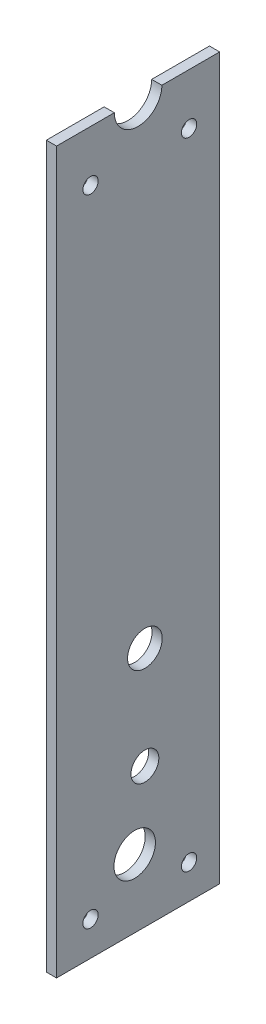
ISO-10303-21;
HEADER;
FILE_DESCRIPTION(('STEP AP214'),'2;1');
FILE_NAME('part.step','',(''),(''),'','','');
FILE_SCHEMA(('AUTOMOTIVE_DESIGN { 1 0 10303 214 1 1 1 1 }'));
ENDSEC;
DATA;
#1=APPLICATION_CONTEXT('core data for automotive mechanical design processes');
#2=APPLICATION_PROTOCOL_DEFINITION('international standard','automotive_design',2000,#1);
#3=PRODUCT_CONTEXT('',#1,'mechanical');
#4=PRODUCT('Part','Part','',(#3));
#5=PRODUCT_RELATED_PRODUCT_CATEGORY('part','',(#4));
#6=PRODUCT_DEFINITION_FORMATION('','',#4);
#7=PRODUCT_DEFINITION_CONTEXT('part definition',#1,'design');
#8=PRODUCT_DEFINITION('design','',#6,#7);
#9=PRODUCT_DEFINITION_SHAPE('','',#8);
#10=(LENGTH_UNIT() NAMED_UNIT(*) SI_UNIT(.MILLI.,.METRE.));
#11=(NAMED_UNIT(*) PLANE_ANGLE_UNIT() SI_UNIT($,.RADIAN.));
#12=(NAMED_UNIT(*) SI_UNIT($,.STERADIAN.) SOLID_ANGLE_UNIT());
#13=UNCERTAINTY_MEASURE_WITH_UNIT(LENGTH_MEASURE(1.E-05),#10,'distance_accuracy_value','');
#14=(GEOMETRIC_REPRESENTATION_CONTEXT(3) GLOBAL_UNCERTAINTY_ASSIGNED_CONTEXT((#13)) GLOBAL_UNIT_ASSIGNED_CONTEXT((#10,
#11,#12)) REPRESENTATION_CONTEXT('',''));
#15=CARTESIAN_POINT('',(0.,0.,0.));
#16=DIRECTION('',(0.,0.,1.));
#17=DIRECTION('',(1.,0.,0.));
#18=AXIS2_PLACEMENT_3D('',#15,#16,#17);
#19=CARTESIAN_POINT('',(0.,42.,30.));
#20=DIRECTION('',(0.,1.,0.));
#21=DIRECTION('',(0.,0.,1.));
#22=AXIS2_PLACEMENT_3D('',#19,#20,#21);
#23=PLANE('',#22);
#24=DIRECTION('',(1.,0.,0.));
#25=VECTOR('',#24,1.);
#26=CARTESIAN_POINT('',(-1.8,42.,61.));
#27=LINE('',#26,#25);
#28=CARTESIAN_POINT('',(-1.5,42.,61.));
#29=VERTEX_POINT('',#28);
#30=CARTESIAN_POINT('',(1.5,42.,61.));
#31=VERTEX_POINT('',#30);
#32=EDGE_CURVE('E30',#29,#31,#27,.T.);
#33=ORIENTED_EDGE('',*,*,#32,.F.);
#34=DIRECTION('',(0.,0.,1.));
#35=VECTOR('',#34,1.);
#36=CARTESIAN_POINT('',(-1.5,42.,30.));
#37=LINE('',#36,#35);
#38=CARTESIAN_POINT('',(-1.5,42.,78.));
#39=VERTEX_POINT('',#38);
#40=EDGE_CURVE('E84',#29,#39,#37,.T.);
#41=ORIENTED_EDGE('',*,*,#40,.T.);
#42=DIRECTION('',(1.,0.,0.));
#43=VECTOR('',#42,1.);
#44=CARTESIAN_POINT('',(0.,42.,78.));
#45=LINE('',#44,#43);
#46=CARTESIAN_POINT('',(1.5,42.,78.));
#47=VERTEX_POINT('',#46);
#48=EDGE_CURVE('E98',#39,#47,#45,.T.);
#49=ORIENTED_EDGE('',*,*,#48,.T.);
#50=DIRECTION('',(0.,0.,1.));
#51=VECTOR('',#50,1.);
#52=CARTESIAN_POINT('',(1.5,42.,30.));
#53=LINE('',#52,#51);
#54=EDGE_CURVE('E85',#31,#47,#53,.T.);
#55=ORIENTED_EDGE('',*,*,#54,.F.);
#56=EDGE_LOOP('',(#33,#41,#49,#55));
#57=FACE_BOUND('',#56,.T.);
#58=ADVANCED_FACE('F16',(#57),#23,.T.);
#59=CARTESIAN_POINT('',(0.,-64.,78.));
#60=DIRECTION('',(0.,0.,1.));
#61=DIRECTION('',(1.,0.,0.));
#62=AXIS2_PLACEMENT_3D('',#59,#60,#61);
#63=PLANE('',#62);
#64=DIRECTION('',(-1.,0.,0.));
#65=VECTOR('',#64,1.);
#66=CARTESIAN_POINT('',(0.,-170.,78.));
#67=LINE('',#66,#65);
#68=CARTESIAN_POINT('',(1.5,-170.,78.));
#69=VERTEX_POINT('',#68);
#70=CARTESIAN_POINT('',(-1.5,-170.,78.));
#71=VERTEX_POINT('',#70);
#72=EDGE_CURVE('E24',#69,#71,#67,.T.);
#73=ORIENTED_EDGE('',*,*,#72,.F.);
#74=DIRECTION('',(0.,-1.,0.));
#75=VECTOR('',#74,1.);
#76=CARTESIAN_POINT('',(1.5,-64.,78.));
#77=LINE('',#76,#75);
#78=EDGE_CURVE('E95',#47,#69,#77,.T.);
#79=ORIENTED_EDGE('',*,*,#78,.F.);
#80=ORIENTED_EDGE('',*,*,#48,.F.);
#81=DIRECTION('',(0.,1.,0.));
#82=VECTOR('',#81,1.);
#83=CARTESIAN_POINT('',(-1.5,-64.,78.));
#84=LINE('',#83,#82);
#85=EDGE_CURVE('E101',#71,#39,#84,.T.);
#86=ORIENTED_EDGE('',*,*,#85,.F.);
#87=EDGE_LOOP('',(#73,#79,#80,#86));
#88=FACE_BOUND('',#87,.T.);
#89=ADVANCED_FACE('F18',(#88),#63,.T.);
#90=CARTESIAN_POINT('',(0.,-170.,30.));
#91=DIRECTION('',(0.,-1.,0.));
#92=DIRECTION('',(0.,0.,-1.));
#93=AXIS2_PLACEMENT_3D('',#90,#91,#92);
#94=PLANE('',#93);
#95=DIRECTION('',(0.,0.,1.));
#96=VECTOR('',#95,1.);
#97=CARTESIAN_POINT('',(1.5,-170.,30.));
#98=LINE('',#97,#96);
#99=CARTESIAN_POINT('',(1.5,-170.,30.));
#100=VERTEX_POINT('',#99);
#101=EDGE_CURVE('E88',#100,#69,#98,.T.);
#102=ORIENTED_EDGE('',*,*,#101,.T.);
#103=ORIENTED_EDGE('',*,*,#72,.T.);
#104=DIRECTION('',(0.,0.,1.));
#105=VECTOR('',#104,1.);
#106=CARTESIAN_POINT('',(-1.5,-170.,30.));
#107=LINE('',#106,#105);
#108=CARTESIAN_POINT('',(-1.5,-170.,30.));
#109=VERTEX_POINT('',#108);
#110=EDGE_CURVE('E92',#109,#71,#107,.T.);
#111=ORIENTED_EDGE('',*,*,#110,.F.);
#112=DIRECTION('',(1.,0.,0.));
#113=VECTOR('',#112,1.);
#114=CARTESIAN_POINT('',(0.,-170.,30.));
#115=LINE('',#114,#113);
#116=EDGE_CURVE('E151',#109,#100,#115,.T.);
#117=ORIENTED_EDGE('',*,*,#116,.T.);
#118=EDGE_LOOP('',(#102,#103,#111,#117));
#119=FACE_BOUND('',#118,.T.);
#120=ADVANCED_FACE('F165',(#119),#94,.T.);
#121=CARTESIAN_POINT('',(-1.5,-64.,30.));
#122=DIRECTION('',(-1.,0.,0.));
#123=DIRECTION('',(0.,0.,1.));
#124=AXIS2_PLACEMENT_3D('',#121,#122,#123);
#125=PLANE('',#124);
#126=CARTESIAN_POINT('',(-1.5,42.,54.));
#127=DIRECTION('',(-1.,0.,0.));
#128=DIRECTION('',(0.,0.,1.));
#129=AXIS2_PLACEMENT_3D('',#126,#127,#128);
#130=CIRCLE('',#129,7.);
#131=CARTESIAN_POINT('',(-1.5,42.,47.));
#132=VERTEX_POINT('',#131);
#133=EDGE_CURVE('E131',#132,#29,#130,.T.);
#134=ORIENTED_EDGE('',*,*,#133,.F.);
#135=CARTESIAN_POINT('',(-1.5,42.,30.));
#136=VERTEX_POINT('',#135);
#137=EDGE_CURVE('E77',#136,#132,#37,.T.);
#138=ORIENTED_EDGE('',*,*,#137,.F.);
#139=DIRECTION('',(0.,-1.,0.));
#140=VECTOR('',#139,1.);
#141=CARTESIAN_POINT('',(-1.5,-64.,30.));
#142=LINE('',#141,#140);
#143=EDGE_CURVE('E154',#136,#109,#142,.T.);
#144=ORIENTED_EDGE('',*,*,#143,.T.);
#145=ORIENTED_EDGE('',*,*,#110,.T.);
#146=ORIENTED_EDGE('',*,*,#85,.T.);
#147=ORIENTED_EDGE('',*,*,#40,.F.);
#148=EDGE_LOOP('',(#134,#138,#144,#145,#146,#147));
#149=FACE_BOUND('',#148,.T.);
#150=CARTESIAN_POINT('',(-1.5,27.,68.));
#151=DIRECTION('',(-1.,0.,0.));
#152=DIRECTION('',(0.,0.,1.));
#153=AXIS2_PLACEMENT_3D('',#150,#151,#152);
#154=CIRCLE('',#153,2.25);
#155=CARTESIAN_POINT('',(-1.5,27.,70.25));
#156=VERTEX_POINT('',#155);
#157=EDGE_CURVE('E128',#156,#156,#154,.T.);
#158=ORIENTED_EDGE('',*,*,#157,.F.);
#159=EDGE_LOOP('',(#158));
#160=FACE_BOUND('',#159,.T.);
#161=CARTESIAN_POINT('',(-1.5,27.,39.));
#162=DIRECTION('',(-1.,0.,0.));
#163=DIRECTION('',(0.,0.,1.));
#164=AXIS2_PLACEMENT_3D('',#161,#162,#163);
#165=CIRCLE('',#164,2.25);
#166=CARTESIAN_POINT('',(-1.5,27.,41.25));
#167=VERTEX_POINT('',#166);
#168=EDGE_CURVE('E125',#167,#167,#165,.T.);
#169=ORIENTED_EDGE('',*,*,#168,.F.);
#170=EDGE_LOOP('',(#169));
#171=FACE_BOUND('',#170,.T.);
#172=CARTESIAN_POINT('',(-1.5,-160.,68.));
#173=DIRECTION('',(-1.,0.,0.));
#174=DIRECTION('',(0.,0.,1.));
#175=AXIS2_PLACEMENT_3D('',#172,#173,#174);
#176=CIRCLE('',#175,2.25);
#177=CARTESIAN_POINT('',(-1.5,-160.,70.25));
#178=VERTEX_POINT('',#177);
#179=EDGE_CURVE('E121',#178,#178,#176,.T.);
#180=ORIENTED_EDGE('',*,*,#179,.F.);
#181=EDGE_LOOP('',(#180));
#182=FACE_BOUND('',#181,.T.);
#183=CARTESIAN_POINT('',(-1.5,-160.,39.));
#184=DIRECTION('',(-1.,0.,0.));
#185=DIRECTION('',(0.,0.,1.));
#186=AXIS2_PLACEMENT_3D('',#183,#184,#185);
#187=CIRCLE('',#186,2.25);
#188=CARTESIAN_POINT('',(-1.5,-160.,41.25));
#189=VERTEX_POINT('',#188);
#190=EDGE_CURVE('E117',#189,#189,#187,.T.);
#191=ORIENTED_EDGE('',*,*,#190,.F.);
#192=EDGE_LOOP('',(#191));
#193=FACE_BOUND('',#192,.T.);
#194=CARTESIAN_POINT('',(-1.5,-99.,52.));
#195=DIRECTION('',(-1.,0.,0.));
#196=DIRECTION('',(0.,0.,1.));
#197=AXIS2_PLACEMENT_3D('',#194,#195,#196);
#198=CIRCLE('',#197,5.1);
#199=CARTESIAN_POINT('',(-1.5,-99.,57.1));
#200=VERTEX_POINT('',#199);
#201=EDGE_CURVE('E113',#200,#200,#198,.T.);
#202=ORIENTED_EDGE('',*,*,#201,.F.);
#203=EDGE_LOOP('',(#202));
#204=FACE_BOUND('',#203,.T.);
#205=CARTESIAN_POINT('',(-1.5,-150.,55.));
#206=DIRECTION('',(-1.,0.,0.));
#207=DIRECTION('',(0.,0.,1.));
#208=AXIS2_PLACEMENT_3D('',#205,#206,#207);
#209=CIRCLE('',#208,6.1);
#210=CARTESIAN_POINT('',(-1.5,-150.,61.1));
#211=VERTEX_POINT('',#210);
#212=EDGE_CURVE('E109',#211,#211,#209,.T.);
#213=ORIENTED_EDGE('',*,*,#212,.F.);
#214=EDGE_LOOP('',(#213));
#215=FACE_BOUND('',#214,.T.);
#216=CARTESIAN_POINT('',(-1.5,-129.,52.));
#217=DIRECTION('',(-1.,0.,0.));
#218=DIRECTION('',(0.,0.,1.));
#219=AXIS2_PLACEMENT_3D('',#216,#217,#218);
#220=CIRCLE('',#219,4.1);
#221=CARTESIAN_POINT('',(-1.5,-129.,56.1));
#222=VERTEX_POINT('',#221);
#223=EDGE_CURVE('E108',#222,#222,#220,.T.);
#224=ORIENTED_EDGE('',*,*,#223,.F.);
#225=EDGE_LOOP('',(#224));
#226=FACE_BOUND('',#225,.T.);
#227=ADVANCED_FACE('F161',(#149,#160,#171,#182,#193,#204,#215,#226),#125,.T.);
#228=DIRECTION('',(1.,0.,0.));
#229=VECTOR('',#228,1.);
#230=CARTESIAN_POINT('',(-1.8,42.,47.));
#231=LINE('',#230,#229);
#232=CARTESIAN_POINT('',(1.5,42.,47.));
#233=VERTEX_POINT('',#232);
#234=EDGE_CURVE('E66',#233,#132,#231,.F.);
#235=ORIENTED_EDGE('',*,*,#234,.F.);
#236=CARTESIAN_POINT('',(1.5,42.,30.));
#237=VERTEX_POINT('',#236);
#238=EDGE_CURVE('E75',#237,#233,#53,.T.);
#239=ORIENTED_EDGE('',*,*,#238,.F.);
#240=DIRECTION('',(-1.,0.,0.));
#241=VECTOR('',#240,1.);
#242=CARTESIAN_POINT('',(0.,42.,30.));
#243=LINE('',#242,#241);
#244=EDGE_CURVE('E156',#237,#136,#243,.T.);
#245=ORIENTED_EDGE('',*,*,#244,.T.);
#246=ORIENTED_EDGE('',*,*,#137,.T.);
#247=EDGE_LOOP('',(#235,#239,#245,#246));
#248=FACE_BOUND('',#247,.T.);
#249=ADVANCED_FACE('F73',(#248),#23,.T.);
#250=CARTESIAN_POINT('',(0.,-64.,30.));
#251=DIRECTION('',(0.,0.,-1.));
#252=DIRECTION('',(-1.,0.,0.));
#253=AXIS2_PLACEMENT_3D('',#250,#251,#252);
#254=PLANE('',#253);
#255=DIRECTION('',(0.,1.,0.));
#256=VECTOR('',#255,1.);
#257=CARTESIAN_POINT('',(1.5,-64.,30.));
#258=LINE('',#257,#256);
#259=EDGE_CURVE('E83',#100,#237,#258,.T.);
#260=ORIENTED_EDGE('',*,*,#259,.F.);
#261=ORIENTED_EDGE('',*,*,#116,.F.);
#262=ORIENTED_EDGE('',*,*,#143,.F.);
#263=ORIENTED_EDGE('',*,*,#244,.F.);
#264=EDGE_LOOP('',(#260,#261,#262,#263));
#265=FACE_BOUND('',#264,.T.);
#266=ADVANCED_FACE('F164',(#265),#254,.T.);
#267=CARTESIAN_POINT('',(1.5,-64.,30.));
#268=DIRECTION('',(1.,0.,0.));
#269=DIRECTION('',(0.,0.,-1.));
#270=AXIS2_PLACEMENT_3D('',#267,#268,#269);
#271=PLANE('',#270);
#272=CARTESIAN_POINT('',(1.5,42.,54.));
#273=DIRECTION('',(1.,0.,0.));
#274=DIRECTION('',(0.,0.,-1.));
#275=AXIS2_PLACEMENT_3D('',#272,#273,#274);
#276=CIRCLE('',#275,7.);
#277=EDGE_CURVE('E10',#31,#233,#276,.T.);
#278=ORIENTED_EDGE('',*,*,#277,.F.);
#279=ORIENTED_EDGE('',*,*,#54,.T.);
#280=ORIENTED_EDGE('',*,*,#78,.T.);
#281=ORIENTED_EDGE('',*,*,#101,.F.);
#282=ORIENTED_EDGE('',*,*,#259,.T.);
#283=ORIENTED_EDGE('',*,*,#238,.T.);
#284=EDGE_LOOP('',(#278,#279,#280,#281,#282,#283));
#285=FACE_BOUND('',#284,.T.);
#286=CARTESIAN_POINT('',(1.5,27.,68.));
#287=DIRECTION('',(1.,0.,0.));
#288=DIRECTION('',(0.,0.,-1.));
#289=AXIS2_PLACEMENT_3D('',#286,#287,#288);
#290=CIRCLE('',#289,2.25);
#291=CARTESIAN_POINT('',(1.5,27.,65.75));
#292=VERTEX_POINT('',#291);
#293=EDGE_CURVE('E129',#292,#292,#290,.T.);
#294=ORIENTED_EDGE('',*,*,#293,.F.);
#295=EDGE_LOOP('',(#294));
#296=FACE_BOUND('',#295,.T.);
#297=CARTESIAN_POINT('',(1.5,27.,39.));
#298=DIRECTION('',(1.,0.,0.));
#299=DIRECTION('',(0.,0.,-1.));
#300=AXIS2_PLACEMENT_3D('',#297,#298,#299);
#301=CIRCLE('',#300,2.25);
#302=CARTESIAN_POINT('',(1.5,27.,36.75));
#303=VERTEX_POINT('',#302);
#304=EDGE_CURVE('E126',#303,#303,#301,.T.);
#305=ORIENTED_EDGE('',*,*,#304,.F.);
#306=EDGE_LOOP('',(#305));
#307=FACE_BOUND('',#306,.T.);
#308=CARTESIAN_POINT('',(1.5,-160.,68.));
#309=DIRECTION('',(1.,0.,0.));
#310=DIRECTION('',(0.,0.,-1.));
#311=AXIS2_PLACEMENT_3D('',#308,#309,#310);
#312=CIRCLE('',#311,2.25);
#313=CARTESIAN_POINT('',(1.5,-160.,65.75));
#314=VERTEX_POINT('',#313);
#315=EDGE_CURVE('E122',#314,#314,#312,.T.);
#316=ORIENTED_EDGE('',*,*,#315,.F.);
#317=EDGE_LOOP('',(#316));
#318=FACE_BOUND('',#317,.T.);
#319=CARTESIAN_POINT('',(1.5,-160.,39.));
#320=DIRECTION('',(1.,0.,0.));
#321=DIRECTION('',(0.,0.,-1.));
#322=AXIS2_PLACEMENT_3D('',#319,#320,#321);
#323=CIRCLE('',#322,2.25);
#324=CARTESIAN_POINT('',(1.5,-160.,36.75));
#325=VERTEX_POINT('',#324);
#326=EDGE_CURVE('E118',#325,#325,#323,.T.);
#327=ORIENTED_EDGE('',*,*,#326,.F.);
#328=EDGE_LOOP('',(#327));
#329=FACE_BOUND('',#328,.T.);
#330=CARTESIAN_POINT('',(1.5,-99.,52.));
#331=DIRECTION('',(1.,0.,0.));
#332=DIRECTION('',(0.,0.,-1.));
#333=AXIS2_PLACEMENT_3D('',#330,#331,#332);
#334=CIRCLE('',#333,5.1);
#335=CARTESIAN_POINT('',(1.5,-99.,46.9));
#336=VERTEX_POINT('',#335);
#337=EDGE_CURVE('E114',#336,#336,#334,.T.);
#338=ORIENTED_EDGE('',*,*,#337,.F.);
#339=EDGE_LOOP('',(#338));
#340=FACE_BOUND('',#339,.T.);
#341=CARTESIAN_POINT('',(1.5,-150.,55.));
#342=DIRECTION('',(1.,0.,0.));
#343=DIRECTION('',(0.,0.,-1.));
#344=AXIS2_PLACEMENT_3D('',#341,#342,#343);
#345=CIRCLE('',#344,6.1);
#346=CARTESIAN_POINT('',(1.5,-150.,48.9));
#347=VERTEX_POINT('',#346);
#348=EDGE_CURVE('E110',#347,#347,#345,.T.);
#349=ORIENTED_EDGE('',*,*,#348,.F.);
#350=EDGE_LOOP('',(#349));
#351=FACE_BOUND('',#350,.T.);
#352=CARTESIAN_POINT('',(1.5,-129.,52.));
#353=DIRECTION('',(1.,0.,0.));
#354=DIRECTION('',(0.,0.,-1.));
#355=AXIS2_PLACEMENT_3D('',#352,#353,#354);
#356=CIRCLE('',#355,4.1);
#357=CARTESIAN_POINT('',(1.5,-129.,47.9));
#358=VERTEX_POINT('',#357);
#359=EDGE_CURVE('E105',#358,#358,#356,.T.);
#360=ORIENTED_EDGE('',*,*,#359,.F.);
#361=EDGE_LOOP('',(#360));
#362=FACE_BOUND('',#361,.T.);
#363=ADVANCED_FACE('F80',(#285,#296,#307,#318,#329,#340,#351,#362),#271,.T.);
#364=CARTESIAN_POINT('',(-1.8,-129.,52.));
#365=DIRECTION('',(1.,0.,0.));
#366=DIRECTION('',(0.,0.,-1.));
#367=AXIS2_PLACEMENT_3D('',#364,#365,#366);
#368=CYLINDRICAL_SURFACE('',#367,4.1);
#369=ORIENTED_EDGE('',*,*,#223,.T.);
#370=EDGE_LOOP('',(#369));
#371=FACE_BOUND('',#370,.T.);
#372=ORIENTED_EDGE('',*,*,#359,.T.);
#373=EDGE_LOOP('',(#372));
#374=FACE_BOUND('',#373,.T.);
#375=ADVANCED_FACE('F230',(#371,#374),#368,.F.);
#376=CARTESIAN_POINT('',(-1.8,-150.,55.));
#377=DIRECTION('',(1.,0.,0.));
#378=DIRECTION('',(0.,0.,-1.));
#379=AXIS2_PLACEMENT_3D('',#376,#377,#378);
#380=CYLINDRICAL_SURFACE('',#379,6.1);
#381=ORIENTED_EDGE('',*,*,#212,.T.);
#382=EDGE_LOOP('',(#381));
#383=FACE_BOUND('',#382,.T.);
#384=ORIENTED_EDGE('',*,*,#348,.T.);
#385=EDGE_LOOP('',(#384));
#386=FACE_BOUND('',#385,.T.);
#387=ADVANCED_FACE('F237',(#383,#386),#380,.F.);
#388=CARTESIAN_POINT('',(-1.8,-99.,52.));
#389=DIRECTION('',(1.,0.,0.));
#390=DIRECTION('',(0.,0.,-1.));
#391=AXIS2_PLACEMENT_3D('',#388,#389,#390);
#392=CYLINDRICAL_SURFACE('',#391,5.1);
#393=ORIENTED_EDGE('',*,*,#201,.T.);
#394=EDGE_LOOP('',(#393));
#395=FACE_BOUND('',#394,.T.);
#396=ORIENTED_EDGE('',*,*,#337,.T.);
#397=EDGE_LOOP('',(#396));
#398=FACE_BOUND('',#397,.T.);
#399=ADVANCED_FACE('F246',(#395,#398),#392,.F.);
#400=CARTESIAN_POINT('',(-1.8,-160.,39.));
#401=DIRECTION('',(1.,0.,0.));
#402=DIRECTION('',(0.,0.,-1.));
#403=AXIS2_PLACEMENT_3D('',#400,#401,#402);
#404=CYLINDRICAL_SURFACE('',#403,2.25);
#405=ORIENTED_EDGE('',*,*,#190,.T.);
#406=EDGE_LOOP('',(#405));
#407=FACE_BOUND('',#406,.T.);
#408=ORIENTED_EDGE('',*,*,#326,.T.);
#409=EDGE_LOOP('',(#408));
#410=FACE_BOUND('',#409,.T.);
#411=ADVANCED_FACE('F255',(#407,#410),#404,.F.);
#412=CARTESIAN_POINT('',(-1.8,-160.,68.));
#413=DIRECTION('',(1.,0.,0.));
#414=DIRECTION('',(0.,0.,-1.));
#415=AXIS2_PLACEMENT_3D('',#412,#413,#414);
#416=CYLINDRICAL_SURFACE('',#415,2.25);
#417=ORIENTED_EDGE('',*,*,#179,.T.);
#418=EDGE_LOOP('',(#417));
#419=FACE_BOUND('',#418,.T.);
#420=ORIENTED_EDGE('',*,*,#315,.T.);
#421=EDGE_LOOP('',(#420));
#422=FACE_BOUND('',#421,.T.);
#423=ADVANCED_FACE('F264',(#419,#422),#416,.F.);
#424=CARTESIAN_POINT('',(-1.8,27.,39.));
#425=DIRECTION('',(1.,0.,0.));
#426=DIRECTION('',(0.,0.,-1.));
#427=AXIS2_PLACEMENT_3D('',#424,#425,#426);
#428=CYLINDRICAL_SURFACE('',#427,2.25);
#429=ORIENTED_EDGE('',*,*,#168,.T.);
#430=EDGE_LOOP('',(#429));
#431=FACE_BOUND('',#430,.T.);
#432=ORIENTED_EDGE('',*,*,#304,.T.);
#433=EDGE_LOOP('',(#432));
#434=FACE_BOUND('',#433,.T.);
#435=ADVANCED_FACE('F273',(#431,#434),#428,.F.);
#436=CARTESIAN_POINT('',(-1.8,27.,68.));
#437=DIRECTION('',(1.,0.,0.));
#438=DIRECTION('',(0.,0.,-1.));
#439=AXIS2_PLACEMENT_3D('',#436,#437,#438);
#440=CYLINDRICAL_SURFACE('',#439,2.25);
#441=ORIENTED_EDGE('',*,*,#157,.T.);
#442=EDGE_LOOP('',(#441));
#443=FACE_BOUND('',#442,.T.);
#444=ORIENTED_EDGE('',*,*,#293,.T.);
#445=EDGE_LOOP('',(#444));
#446=FACE_BOUND('',#445,.T.);
#447=ADVANCED_FACE('F282',(#443,#446),#440,.F.);
#448=CARTESIAN_POINT('',(-1.8,42.,54.));
#449=DIRECTION('',(1.,0.,0.));
#450=DIRECTION('',(0.,0.,-1.));
#451=AXIS2_PLACEMENT_3D('',#448,#449,#450);
#452=CYLINDRICAL_SURFACE('',#451,7.);
#453=ORIENTED_EDGE('',*,*,#133,.T.);
#454=ORIENTED_EDGE('',*,*,#32,.T.);
#455=ORIENTED_EDGE('',*,*,#277,.T.);
#456=ORIENTED_EDGE('',*,*,#234,.T.);
#457=EDGE_LOOP('',(#453,#454,#455,#456));
#458=FACE_BOUND('',#457,.T.);
#459=ADVANCED_FACE('F65',(#458),#452,.F.);
#460=CLOSED_SHELL('',(#58,#89,#120,#227,#249,#266,#363,#375,#387,#399,#411,#423,#435,#447,#459));
#461=MANIFOLD_SOLID_BREP('B1',#460);
#462=ADVANCED_BREP_SHAPE_REPRESENTATION('',(#18,#461),#14);
#463=SHAPE_DEFINITION_REPRESENTATION(#9,#462);
ENDSEC;
END-ISO-10303-21;
